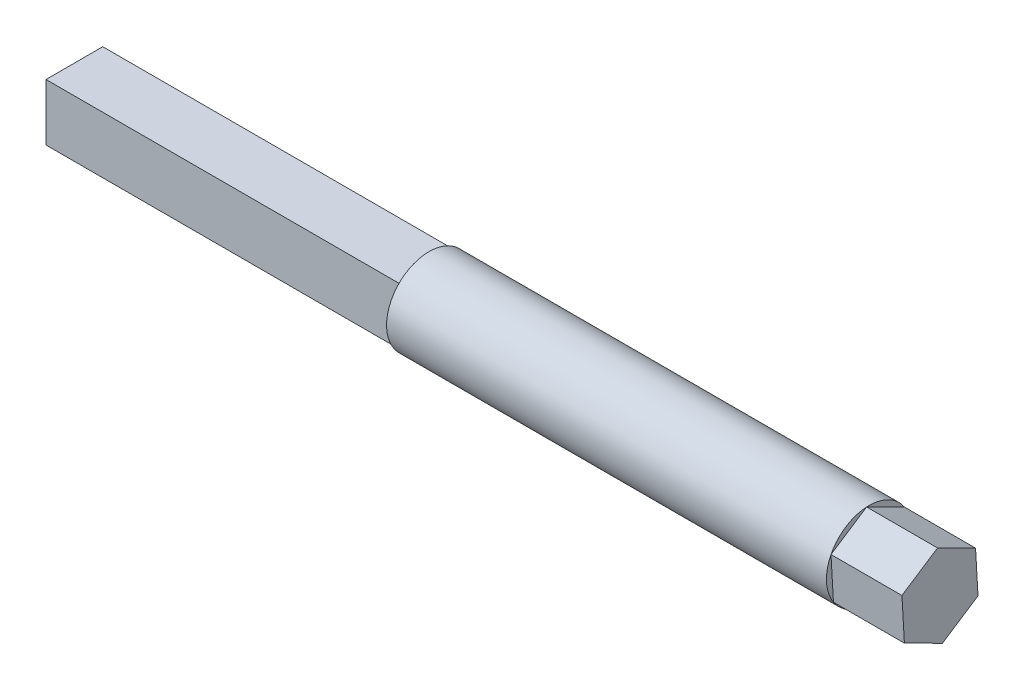
ISO-10303-21;
HEADER;
FILE_DESCRIPTION(('STEP AP214'),'2;1');
FILE_NAME('part.step','',(''),(''),'','','');
FILE_SCHEMA(('AUTOMOTIVE_DESIGN { 1 0 10303 214 1 1 1 1 }'));
ENDSEC;
DATA;
#1=APPLICATION_CONTEXT('core data for automotive mechanical design processes');
#2=APPLICATION_PROTOCOL_DEFINITION('international standard','automotive_design',2000,#1);
#3=PRODUCT_CONTEXT('',#1,'mechanical');
#4=PRODUCT('Part','Part','',(#3));
#5=PRODUCT_RELATED_PRODUCT_CATEGORY('part','',(#4));
#6=PRODUCT_DEFINITION_FORMATION('','',#4);
#7=PRODUCT_DEFINITION_CONTEXT('part definition',#1,'design');
#8=PRODUCT_DEFINITION('design','',#6,#7);
#9=PRODUCT_DEFINITION_SHAPE('','',#8);
#10=(LENGTH_UNIT() NAMED_UNIT(*) SI_UNIT(.MILLI.,.METRE.));
#11=(NAMED_UNIT(*) PLANE_ANGLE_UNIT() SI_UNIT($,.RADIAN.));
#12=(NAMED_UNIT(*) SI_UNIT($,.STERADIAN.) SOLID_ANGLE_UNIT());
#13=UNCERTAINTY_MEASURE_WITH_UNIT(LENGTH_MEASURE(1.E-05),#10,'distance_accuracy_value','');
#14=(GEOMETRIC_REPRESENTATION_CONTEXT(3) GLOBAL_UNCERTAINTY_ASSIGNED_CONTEXT((#13)) GLOBAL_UNIT_ASSIGNED_CONTEXT((#10,
#11,#12)) REPRESENTATION_CONTEXT('',''));
#15=CARTESIAN_POINT('',(0.,0.,0.));
#16=DIRECTION('',(0.,0.,1.));
#17=DIRECTION('',(1.,0.,0.));
#18=AXIS2_PLACEMENT_3D('',#15,#16,#17);
#19=CARTESIAN_POINT('',(61.,0.,0.));
#20=DIRECTION('',(1.,0.,0.));
#21=DIRECTION('',(0.,0.,-1.));
#22=AXIS2_PLACEMENT_3D('',#19,#20,#21);
#23=PLANE('',#22);
#24=DIRECTION('',(0.,0.998358668660678,0.0572710110795971));
#25=VECTOR('',#24,1.);
#26=CARTESIAN_POINT('',(61.,-1.34874355150496,-2.67971842406507));
#27=LINE('',#26,#25);
#28=CARTESIAN_POINT('',(61.,-1.34874355150496,-2.67971842406507));
#29=VERTEX_POINT('',#28);
#30=CARTESIAN_POINT('',(61.,1.64633245447707,-2.50790539082628));
#31=VERTEX_POINT('',#30);
#32=EDGE_CURVE('E168',#29,#31,#27,.T.);
#33=ORIENTED_EDGE('',*,*,#32,.F.);
#34=CARTESIAN_POINT('',(61.,0.,0.));
#35=DIRECTION('',(1.,0.,0.));
#36=DIRECTION('',(0.,0.,-1.));
#37=AXIS2_PLACEMENT_3D('',#34,#35,#36);
#38=CIRCLE('',#37,3.);
#39=EDGE_CURVE('E58',#29,#31,#38,.T.);
#40=ORIENTED_EDGE('',*,*,#39,.T.);
#41=EDGE_LOOP('',(#33,#40));
#42=FACE_BOUND('',#41,.T.);
#43=ADVANCED_FACE('F48',(#42),#23,.T.);
#44=DIRECTION('',(0.,0.54877748482569,-0.835968463608759));
#45=VECTOR('',#44,1.);
#46=CARTESIAN_POINT('',(61.,-2.99507600598203,-0.171813033238792));
#47=LINE('',#46,#45);
#48=CARTESIAN_POINT('',(61.,-2.99507600598203,-0.171813033238793));
#49=VERTEX_POINT('',#48);
#50=EDGE_CURVE('E157',#49,#29,#47,.T.);
#51=ORIENTED_EDGE('',*,*,#50,.F.);
#52=EDGE_CURVE('E207',#49,#29,#38,.T.);
#53=ORIENTED_EDGE('',*,*,#52,.T.);
#54=EDGE_LOOP('',(#51,#53));
#55=FACE_BOUND('',#54,.T.);
#56=ADVANCED_FACE('F255',(#55),#23,.T.);
#57=DIRECTION('',(0.,-0.449581183834988,-0.893239474688356));
#58=VECTOR('',#57,1.);
#59=CARTESIAN_POINT('',(61.,-1.64633245447707,2.50790539082628));
#60=LINE('',#59,#58);
#61=CARTESIAN_POINT('',(61.,-1.64633245447707,2.50790539082628));
#62=VERTEX_POINT('',#61);
#63=EDGE_CURVE('E180',#62,#49,#60,.T.);
#64=ORIENTED_EDGE('',*,*,#63,.F.);
#65=EDGE_CURVE('E212',#62,#49,#38,.T.);
#66=ORIENTED_EDGE('',*,*,#65,.T.);
#67=EDGE_LOOP('',(#64,#66));
#68=FACE_BOUND('',#67,.T.);
#69=ADVANCED_FACE('F259',(#68),#23,.T.);
#70=DIRECTION('',(0.,-0.998358668660678,-0.0572710110795974));
#71=VECTOR('',#70,1.);
#72=CARTESIAN_POINT('',(61.,1.34874355150496,2.67971842406507));
#73=LINE('',#72,#71);
#74=CARTESIAN_POINT('',(61.,1.34874355150496,2.67971842406507));
#75=VERTEX_POINT('',#74);
#76=EDGE_CURVE('E177',#75,#62,#73,.T.);
#77=ORIENTED_EDGE('',*,*,#76,.F.);
#78=EDGE_CURVE('E216',#75,#62,#38,.T.);
#79=ORIENTED_EDGE('',*,*,#78,.T.);
#80=EDGE_LOOP('',(#77,#79));
#81=FACE_BOUND('',#80,.T.);
#82=ADVANCED_FACE('F357',(#81),#23,.T.);
#83=DIRECTION('',(0.,-0.548777484825691,0.835968463608759));
#84=VECTOR('',#83,1.);
#85=CARTESIAN_POINT('',(61.,2.99507600598203,0.171813033238791));
#86=LINE('',#85,#84);
#87=CARTESIAN_POINT('',(61.,2.99507600598203,0.171813033238791));
#88=VERTEX_POINT('',#87);
#89=EDGE_CURVE('E174',#88,#75,#86,.T.);
#90=ORIENTED_EDGE('',*,*,#89,.F.);
#91=EDGE_CURVE('E57',#88,#75,#38,.T.);
#92=ORIENTED_EDGE('',*,*,#91,.T.);
#93=EDGE_LOOP('',(#90,#92));
#94=FACE_BOUND('',#93,.T.);
#95=ADVANCED_FACE('F226',(#94),#23,.T.);
#96=CARTESIAN_POINT('',(30.,0.,0.));
#97=DIRECTION('',(1.,0.,0.));
#98=DIRECTION('',(0.,0.,-1.));
#99=AXIS2_PLACEMENT_3D('',#96,#97,#98);
#100=PLANE('',#99);
#101=DIRECTION('',(0.,0.,-1.));
#102=VECTOR('',#101,1.);
#103=CARTESIAN_POINT('',(30.,2.,-2.));
#104=LINE('',#103,#102);
#105=CARTESIAN_POINT('',(30.,2.,2.));
#106=VERTEX_POINT('',#105);
#107=CARTESIAN_POINT('',(30.,2.,-2.));
#108=VERTEX_POINT('',#107);
#109=EDGE_CURVE('E143',#106,#108,#104,.T.);
#110=ORIENTED_EDGE('',*,*,#109,.F.);
#111=DIRECTION('',(0.,1.,0.));
#112=VECTOR('',#111,1.);
#113=CARTESIAN_POINT('',(30.,2.,2.));
#114=LINE('',#113,#112);
#115=CARTESIAN_POINT('',(30.,-2.,2.));
#116=VERTEX_POINT('',#115);
#117=EDGE_CURVE('E73',#116,#106,#114,.T.);
#118=ORIENTED_EDGE('',*,*,#117,.F.);
#119=DIRECTION('',(0.,0.,1.));
#120=VECTOR('',#119,1.);
#121=CARTESIAN_POINT('',(30.,-2.,-2.));
#122=LINE('',#121,#120);
#123=CARTESIAN_POINT('',(30.,-2.,-2.));
#124=VERTEX_POINT('',#123);
#125=EDGE_CURVE('E149',#124,#116,#122,.T.);
#126=ORIENTED_EDGE('',*,*,#125,.F.);
#127=DIRECTION('',(0.,-1.,0.));
#128=VECTOR('',#127,1.);
#129=CARTESIAN_POINT('',(30.,2.,-2.));
#130=LINE('',#129,#128);
#131=EDGE_CURVE('E420',#108,#124,#130,.T.);
#132=ORIENTED_EDGE('',*,*,#131,.F.);
#133=EDGE_LOOP('',(#110,#118,#126,#132));
#134=FACE_BOUND('',#133,.T.);
#135=CARTESIAN_POINT('',(30.,0.,0.));
#136=DIRECTION('',(1.,0.,0.));
#137=DIRECTION('',(0.,0.,-1.));
#138=AXIS2_PLACEMENT_3D('',#135,#136,#137);
#139=CIRCLE('',#138,3.);
#140=CARTESIAN_POINT('',(30.,0.,-3.));
#141=VERTEX_POINT('',#140);
#142=EDGE_CURVE('E52',#141,#141,#139,.T.);
#143=ORIENTED_EDGE('',*,*,#142,.F.);
#144=EDGE_LOOP('',(#143));
#145=FACE_BOUND('',#144,.T.);
#146=ADVANCED_FACE('F246',(#134,#145),#100,.F.);
#147=CARTESIAN_POINT('',(61.,0.,0.));
#148=DIRECTION('',(-1.,0.,0.));
#149=DIRECTION('',(0.,0.,1.));
#150=AXIS2_PLACEMENT_3D('',#147,#148,#149);
#151=CYLINDRICAL_SURFACE('',#150,3.);
#152=EDGE_CURVE('E12',#31,#88,#38,.T.);
#153=ORIENTED_EDGE('',*,*,#152,.F.);
#154=ORIENTED_EDGE('',*,*,#39,.F.);
#155=ORIENTED_EDGE('',*,*,#52,.F.);
#156=ORIENTED_EDGE('',*,*,#65,.F.);
#157=ORIENTED_EDGE('',*,*,#78,.F.);
#158=ORIENTED_EDGE('',*,*,#91,.F.);
#159=EDGE_LOOP('',(#153,#154,#155,#156,#157,#158));
#160=FACE_BOUND('',#159,.T.);
#161=ORIENTED_EDGE('',*,*,#142,.T.);
#162=EDGE_LOOP('',(#161));
#163=FACE_BOUND('',#162,.T.);
#164=ADVANCED_FACE('F50',(#160,#163),#151,.T.);
#165=DIRECTION('',(0.,0.449581183834988,0.893239474688357));
#166=VECTOR('',#165,1.);
#167=CARTESIAN_POINT('',(61.,1.64633245447707,-2.50790539082628));
#168=LINE('',#167,#166);
#169=EDGE_CURVE('E171',#31,#88,#168,.T.);
#170=ORIENTED_EDGE('',*,*,#169,.F.);
#171=ORIENTED_EDGE('',*,*,#152,.T.);
#172=EDGE_LOOP('',(#170,#171));
#173=FACE_BOUND('',#172,.T.);
#174=ADVANCED_FACE('F244',(#173),#23,.T.);
#175=CARTESIAN_POINT('',(66.,-1.34874355150496,-2.67971842406507));
#176=DIRECTION('',(0.,-0.0572710110795971,0.998358668660678));
#177=DIRECTION('',(0.,-0.998358668660678,-0.0572710110795971));
#178=AXIS2_PLACEMENT_3D('',#175,#176,#177);
#179=PLANE('',#178);
#180=ORIENTED_EDGE('',*,*,#32,.T.);
#181=DIRECTION('',(-1.,0.,0.));
#182=VECTOR('',#181,1.);
#183=CARTESIAN_POINT('',(66.,1.64633245447707,-2.50790539082628));
#184=LINE('',#183,#182);
#185=CARTESIAN_POINT('',(66.,1.64633245447707,-2.50790539082628));
#186=VERTEX_POINT('',#185);
#187=EDGE_CURVE('E199',#186,#31,#184,.T.);
#188=ORIENTED_EDGE('',*,*,#187,.F.);
#189=DIRECTION('',(0.,0.998358668660678,0.0572710110795971));
#190=VECTOR('',#189,1.);
#191=CARTESIAN_POINT('',(66.,-1.34874355150496,-2.67971842406507));
#192=LINE('',#191,#190);
#193=CARTESIAN_POINT('',(66.,-1.34874355150496,-2.67971842406507));
#194=VERTEX_POINT('',#193);
#195=EDGE_CURVE('E153',#194,#186,#192,.T.);
#196=ORIENTED_EDGE('',*,*,#195,.F.);
#197=DIRECTION('',(-1.,0.,0.));
#198=VECTOR('',#197,1.);
#199=CARTESIAN_POINT('',(66.,-1.34874355150496,-2.67971842406507));
#200=LINE('',#199,#198);
#201=EDGE_CURVE('E167',#194,#29,#200,.T.);
#202=ORIENTED_EDGE('',*,*,#201,.T.);
#203=EDGE_LOOP('',(#180,#188,#196,#202));
#204=FACE_BOUND('',#203,.T.);
#205=ADVANCED_FACE('F251',(#204),#179,.F.);
#206=CARTESIAN_POINT('',(66.,1.64633245447707,-2.50790539082628));
#207=DIRECTION('',(0.,-0.893239474688356,0.449581183834988));
#208=DIRECTION('',(0.,-0.449581183834988,-0.893239474688356));
#209=AXIS2_PLACEMENT_3D('',#206,#207,#208);
#210=PLANE('',#209);
#211=ORIENTED_EDGE('',*,*,#169,.T.);
#212=DIRECTION('',(-1.,0.,0.));
#213=VECTOR('',#212,1.);
#214=CARTESIAN_POINT('',(66.,2.99507600598203,0.171813033238791));
#215=LINE('',#214,#213);
#216=CARTESIAN_POINT('',(66.,2.99507600598203,0.171813033238791));
#217=VERTEX_POINT('',#216);
#218=EDGE_CURVE('E196',#217,#88,#215,.T.);
#219=ORIENTED_EDGE('',*,*,#218,.F.);
#220=DIRECTION('',(0.,0.449581183834988,0.893239474688357));
#221=VECTOR('',#220,1.);
#222=CARTESIAN_POINT('',(66.,1.64633245447707,-2.50790539082628));
#223=LINE('',#222,#221);
#224=EDGE_CURVE('E156',#186,#217,#223,.T.);
#225=ORIENTED_EDGE('',*,*,#224,.F.);
#226=ORIENTED_EDGE('',*,*,#187,.T.);
#227=EDGE_LOOP('',(#211,#219,#225,#226));
#228=FACE_BOUND('',#227,.T.);
#229=ADVANCED_FACE('F242',(#228),#210,.F.);
#230=CARTESIAN_POINT('',(66.,2.99507600598203,0.171813033238791));
#231=DIRECTION('',(0.,-0.835968463608759,-0.548777484825691));
#232=DIRECTION('',(0.,0.548777484825691,-0.835968463608759));
#233=AXIS2_PLACEMENT_3D('',#230,#231,#232);
#234=PLANE('',#233);
#235=ORIENTED_EDGE('',*,*,#89,.T.);
#236=DIRECTION('',(-1.,0.,0.));
#237=VECTOR('',#236,1.);
#238=CARTESIAN_POINT('',(66.,1.34874355150496,2.67971842406507));
#239=LINE('',#238,#237);
#240=CARTESIAN_POINT('',(66.,1.34874355150496,2.67971842406507));
#241=VERTEX_POINT('',#240);
#242=EDGE_CURVE('E193',#241,#75,#239,.T.);
#243=ORIENTED_EDGE('',*,*,#242,.F.);
#244=DIRECTION('',(0.,-0.548777484825691,0.835968463608759));
#245=VECTOR('',#244,1.);
#246=CARTESIAN_POINT('',(66.,2.99507600598203,0.171813033238791));
#247=LINE('',#246,#245);
#248=EDGE_CURVE('E159',#217,#241,#247,.T.);
#249=ORIENTED_EDGE('',*,*,#248,.F.);
#250=ORIENTED_EDGE('',*,*,#218,.T.);
#251=EDGE_LOOP('',(#235,#243,#249,#250));
#252=FACE_BOUND('',#251,.T.);
#253=ADVANCED_FACE('F230',(#252),#234,.F.);
#254=CARTESIAN_POINT('',(66.,1.34874355150496,2.67971842406507));
#255=DIRECTION('',(0.,0.0572710110795974,-0.998358668660678));
#256=DIRECTION('',(0.,0.998358668660678,0.0572710110795974));
#257=AXIS2_PLACEMENT_3D('',#254,#255,#256);
#258=PLANE('',#257);
#259=ORIENTED_EDGE('',*,*,#76,.T.);
#260=DIRECTION('',(-1.,0.,0.));
#261=VECTOR('',#260,1.);
#262=CARTESIAN_POINT('',(66.,-1.64633245447707,2.50790539082628));
#263=LINE('',#262,#261);
#264=CARTESIAN_POINT('',(66.,-1.64633245447707,2.50790539082628));
#265=VERTEX_POINT('',#264);
#266=EDGE_CURVE('E190',#265,#62,#263,.T.);
#267=ORIENTED_EDGE('',*,*,#266,.F.);
#268=DIRECTION('',(0.,-0.998358668660678,-0.0572710110795974));
#269=VECTOR('',#268,1.);
#270=CARTESIAN_POINT('',(66.,1.34874355150496,2.67971842406507));
#271=LINE('',#270,#269);
#272=EDGE_CURVE('E161',#241,#265,#271,.T.);
#273=ORIENTED_EDGE('',*,*,#272,.F.);
#274=ORIENTED_EDGE('',*,*,#242,.T.);
#275=EDGE_LOOP('',(#259,#267,#273,#274));
#276=FACE_BOUND('',#275,.T.);
#277=ADVANCED_FACE('F235',(#276),#258,.F.);
#278=CARTESIAN_POINT('',(66.,-1.64633245447707,2.50790539082628));
#279=DIRECTION('',(0.,0.893239474688357,-0.449581183834988));
#280=DIRECTION('',(0.,0.449581183834988,0.893239474688357));
#281=AXIS2_PLACEMENT_3D('',#278,#279,#280);
#282=PLANE('',#281);
#283=ORIENTED_EDGE('',*,*,#63,.T.);
#284=DIRECTION('',(-1.,0.,0.));
#285=VECTOR('',#284,1.);
#286=CARTESIAN_POINT('',(66.,-2.99507600598203,-0.171813033238792));
#287=LINE('',#286,#285);
#288=CARTESIAN_POINT('',(66.,-2.99507600598203,-0.171813033238792));
#289=VERTEX_POINT('',#288);
#290=EDGE_CURVE('E187',#289,#49,#287,.T.);
#291=ORIENTED_EDGE('',*,*,#290,.F.);
#292=DIRECTION('',(0.,-0.449581183834988,-0.893239474688356));
#293=VECTOR('',#292,1.);
#294=CARTESIAN_POINT('',(66.,-1.64633245447707,2.50790539082628));
#295=LINE('',#294,#293);
#296=EDGE_CURVE('E163',#265,#289,#295,.T.);
#297=ORIENTED_EDGE('',*,*,#296,.F.);
#298=ORIENTED_EDGE('',*,*,#266,.T.);
#299=EDGE_LOOP('',(#283,#291,#297,#298));
#300=FACE_BOUND('',#299,.T.);
#301=ADVANCED_FACE('F270',(#300),#282,.F.);
#302=CARTESIAN_POINT('',(66.,-2.99507600598203,-0.171813033238792));
#303=DIRECTION('',(0.,0.835968463608759,0.54877748482569));
#304=DIRECTION('',(0.,-0.54877748482569,0.835968463608759));
#305=AXIS2_PLACEMENT_3D('',#302,#303,#304);
#306=PLANE('',#305);
#307=ORIENTED_EDGE('',*,*,#50,.T.);
#308=ORIENTED_EDGE('',*,*,#201,.F.);
#309=DIRECTION('',(0.,0.54877748482569,-0.835968463608759));
#310=VECTOR('',#309,1.);
#311=CARTESIAN_POINT('',(66.,-2.99507600598203,-0.171813033238792));
#312=LINE('',#311,#310);
#313=EDGE_CURVE('E165',#289,#194,#312,.T.);
#314=ORIENTED_EDGE('',*,*,#313,.F.);
#315=ORIENTED_EDGE('',*,*,#290,.T.);
#316=EDGE_LOOP('',(#307,#308,#314,#315));
#317=FACE_BOUND('',#316,.T.);
#318=ADVANCED_FACE('F273',(#317),#306,.F.);
#319=CARTESIAN_POINT('',(66.,0.,0.));
#320=DIRECTION('',(1.,0.,0.));
#321=DIRECTION('',(0.,0.,-1.));
#322=AXIS2_PLACEMENT_3D('',#319,#320,#321);
#323=PLANE('',#322);
#324=ORIENTED_EDGE('',*,*,#195,.T.);
#325=ORIENTED_EDGE('',*,*,#224,.T.);
#326=ORIENTED_EDGE('',*,*,#248,.T.);
#327=ORIENTED_EDGE('',*,*,#272,.T.);
#328=ORIENTED_EDGE('',*,*,#296,.T.);
#329=ORIENTED_EDGE('',*,*,#313,.T.);
#330=EDGE_LOOP('',(#324,#325,#326,#327,#328,#329));
#331=FACE_BOUND('',#330,.T.);
#332=ADVANCED_FACE('F239',(#331),#323,.T.);
#333=CARTESIAN_POINT('',(30.,2.,2.));
#334=DIRECTION('',(0.,0.,1.));
#335=DIRECTION('',(0.,-1.,0.));
#336=AXIS2_PLACEMENT_3D('',#333,#334,#335);
#337=PLANE('',#336);
#338=DIRECTION('',(0.,1.,0.));
#339=VECTOR('',#338,1.);
#340=CARTESIAN_POINT('',(5.,-2.,2.));
#341=LINE('',#340,#339);
#342=CARTESIAN_POINT('',(5.,-2.,2.));
#343=VERTEX_POINT('',#342);
#344=CARTESIAN_POINT('',(5.,2.,2.));
#345=VERTEX_POINT('',#344);
#346=EDGE_CURVE('E65',#343,#345,#341,.T.);
#347=ORIENTED_EDGE('',*,*,#346,.F.);
#348=DIRECTION('',(-1.,0.,0.));
#349=VECTOR('',#348,1.);
#350=CARTESIAN_POINT('',(30.,-2.,2.));
#351=LINE('',#350,#349);
#352=EDGE_CURVE('E147',#116,#343,#351,.T.);
#353=ORIENTED_EDGE('',*,*,#352,.F.);
#354=ORIENTED_EDGE('',*,*,#117,.T.);
#355=DIRECTION('',(-1.,0.,0.));
#356=VECTOR('',#355,1.);
#357=CARTESIAN_POINT('',(30.,2.,2.));
#358=LINE('',#357,#356);
#359=EDGE_CURVE('E145',#106,#345,#358,.T.);
#360=ORIENTED_EDGE('',*,*,#359,.T.);
#361=EDGE_LOOP('',(#347,#353,#354,#360));
#362=FACE_BOUND('',#361,.T.);
#363=ADVANCED_FACE('F280',(#362),#337,.T.);
#364=CARTESIAN_POINT('',(30.,-2.,-2.));
#365=DIRECTION('',(0.,-1.,0.));
#366=DIRECTION('',(0.,0.,-1.));
#367=AXIS2_PLACEMENT_3D('',#364,#365,#366);
#368=PLANE('',#367);
#369=DIRECTION('',(0.,0.,1.));
#370=VECTOR('',#369,1.);
#371=CARTESIAN_POINT('',(5.,-2.,-2.));
#372=LINE('',#371,#370);
#373=CARTESIAN_POINT('',(5.,-2.,-2.));
#374=VERTEX_POINT('',#373);
#375=EDGE_CURVE('E139',#374,#343,#372,.T.);
#376=ORIENTED_EDGE('',*,*,#375,.F.);
#377=DIRECTION('',(-1.,0.,0.));
#378=VECTOR('',#377,1.);
#379=CARTESIAN_POINT('',(30.,-2.,-2.));
#380=LINE('',#379,#378);
#381=EDGE_CURVE('E138',#124,#374,#380,.T.);
#382=ORIENTED_EDGE('',*,*,#381,.F.);
#383=ORIENTED_EDGE('',*,*,#125,.T.);
#384=ORIENTED_EDGE('',*,*,#352,.T.);
#385=EDGE_LOOP('',(#376,#382,#383,#384));
#386=FACE_BOUND('',#385,.T.);
#387=ADVANCED_FACE('F283',(#386),#368,.T.);
#388=CARTESIAN_POINT('',(30.,2.,-2.));
#389=DIRECTION('',(0.,0.,-1.));
#390=DIRECTION('',(0.,1.,0.));
#391=AXIS2_PLACEMENT_3D('',#388,#389,#390);
#392=PLANE('',#391);
#393=DIRECTION('',(0.,-1.,0.));
#394=VECTOR('',#393,1.);
#395=CARTESIAN_POINT('',(5.,-2.,-2.));
#396=LINE('',#395,#394);
#397=CARTESIAN_POINT('',(5.,2.,-2.));
#398=VERTEX_POINT('',#397);
#399=EDGE_CURVE('E127',#398,#374,#396,.T.);
#400=ORIENTED_EDGE('',*,*,#399,.F.);
#401=DIRECTION('',(-1.,0.,0.));
#402=VECTOR('',#401,1.);
#403=CARTESIAN_POINT('',(30.,2.,-2.));
#404=LINE('',#403,#402);
#405=EDGE_CURVE('E136',#108,#398,#404,.T.);
#406=ORIENTED_EDGE('',*,*,#405,.F.);
#407=ORIENTED_EDGE('',*,*,#131,.T.);
#408=ORIENTED_EDGE('',*,*,#381,.T.);
#409=EDGE_LOOP('',(#400,#406,#407,#408));
#410=FACE_BOUND('',#409,.T.);
#411=ADVANCED_FACE('F134',(#410),#392,.T.);
#412=CARTESIAN_POINT('',(30.,2.,-2.));
#413=DIRECTION('',(0.,1.,0.));
#414=DIRECTION('',(0.,0.,1.));
#415=AXIS2_PLACEMENT_3D('',#412,#413,#414);
#416=PLANE('',#415);
#417=DIRECTION('',(0.,0.,-1.));
#418=VECTOR('',#417,1.);
#419=CARTESIAN_POINT('',(5.,2.,-2.));
#420=LINE('',#419,#418);
#421=EDGE_CURVE('E124',#345,#398,#420,.T.);
#422=ORIENTED_EDGE('',*,*,#421,.F.);
#423=ORIENTED_EDGE('',*,*,#359,.F.);
#424=ORIENTED_EDGE('',*,*,#109,.T.);
#425=ORIENTED_EDGE('',*,*,#405,.T.);
#426=EDGE_LOOP('',(#422,#423,#424,#425));
#427=FACE_BOUND('',#426,.T.);
#428=ADVANCED_FACE('F141',(#427),#416,.T.);
#429=CARTESIAN_POINT('',(5.,0.,0.));
#430=DIRECTION('',(1.,0.,0.));
#431=DIRECTION('',(0.,0.,-1.));
#432=AXIS2_PLACEMENT_3D('',#429,#430,#431);
#433=PLANE('',#432);
#434=ORIENTED_EDGE('',*,*,#346,.T.);
#435=ORIENTED_EDGE('',*,*,#421,.T.);
#436=ORIENTED_EDGE('',*,*,#399,.T.);
#437=ORIENTED_EDGE('',*,*,#375,.T.);
#438=EDGE_LOOP('',(#434,#435,#436,#437));
#439=FACE_BOUND('',#438,.T.);
#440=ADVANCED_FACE('F126',(#439),#433,.F.);
#441=CLOSED_SHELL('',(#43,#56,#69,#82,#95,#146,#164,#174,#205,#229,#253,#277,#301,#318,#332,
#363,#387,#411,#428,#440));
#442=MANIFOLD_SOLID_BREP('B2',#441);
#443=ADVANCED_BREP_SHAPE_REPRESENTATION('',(#18,#442),#14);
#444=SHAPE_DEFINITION_REPRESENTATION(#9,#443);
ENDSEC;
END-ISO-10303-21;
